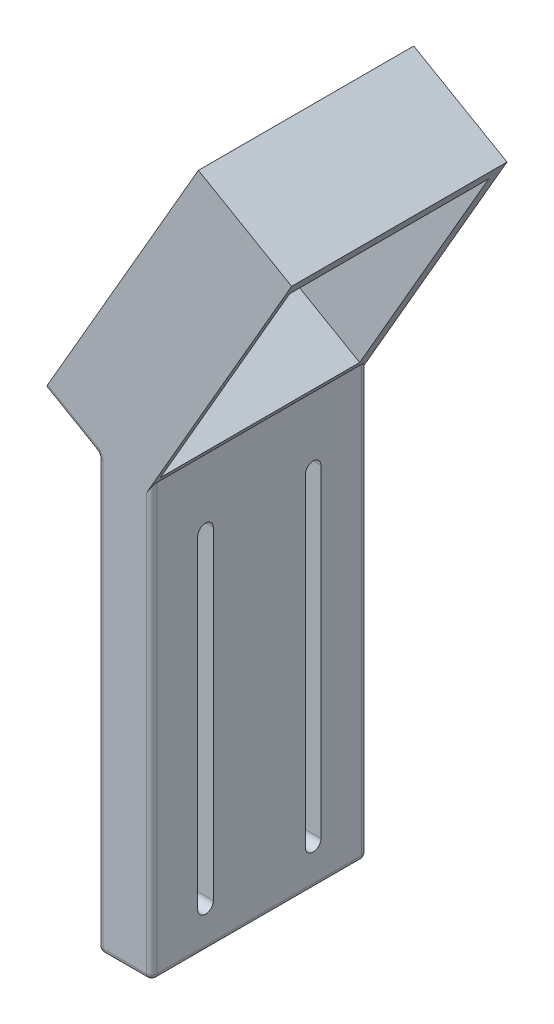
ISO-10303-21;
HEADER;
FILE_DESCRIPTION(('STEP AP214'),'2;1');
FILE_NAME('part.step','',(''),(''),'','','');
FILE_SCHEMA(('AUTOMOTIVE_DESIGN { 1 0 10303 214 1 1 1 1 }'));
ENDSEC;
DATA;
#1=APPLICATION_CONTEXT('core data for automotive mechanical design processes');
#2=APPLICATION_PROTOCOL_DEFINITION('international standard','automotive_design',2000,#1);
#3=PRODUCT_CONTEXT('',#1,'mechanical');
#4=PRODUCT('Part','Part','',(#3));
#5=PRODUCT_RELATED_PRODUCT_CATEGORY('part','',(#4));
#6=PRODUCT_DEFINITION_FORMATION('','',#4);
#7=PRODUCT_DEFINITION_CONTEXT('part definition',#1,'design');
#8=PRODUCT_DEFINITION('design','',#6,#7);
#9=PRODUCT_DEFINITION_SHAPE('','',#8);
#10=(LENGTH_UNIT() NAMED_UNIT(*) SI_UNIT(.MILLI.,.METRE.));
#11=(NAMED_UNIT(*) PLANE_ANGLE_UNIT() SI_UNIT($,.RADIAN.));
#12=(NAMED_UNIT(*) SI_UNIT($,.STERADIAN.) SOLID_ANGLE_UNIT());
#13=UNCERTAINTY_MEASURE_WITH_UNIT(LENGTH_MEASURE(1.E-05),#10,'distance_accuracy_value','');
#14=(GEOMETRIC_REPRESENTATION_CONTEXT(3) GLOBAL_UNCERTAINTY_ASSIGNED_CONTEXT((#13)) GLOBAL_UNIT_ASSIGNED_CONTEXT((#10,
#11,#12)) REPRESENTATION_CONTEXT('',''));
#15=CARTESIAN_POINT('',(0.,0.,0.));
#16=DIRECTION('',(0.,0.,1.));
#17=DIRECTION('',(1.,0.,0.));
#18=AXIS2_PLACEMENT_3D('',#15,#16,#17);
#19=CARTESIAN_POINT('',(0.,0.,40.));
#20=DIRECTION('',(1.,0.,0.));
#21=DIRECTION('',(0.,0.,-1.));
#22=AXIS2_PLACEMENT_3D('',#19,#20,#21);
#23=PLANE('',#22);
#24=DIRECTION('',(0.,1.,0.));
#25=VECTOR('',#24,1.);
#26=CARTESIAN_POINT('',(0.,7.5,11.45));
#27=LINE('',#26,#25);
#28=CARTESIAN_POINT('',(0.,7.5,11.45));
#29=VERTEX_POINT('',#28);
#30=CARTESIAN_POINT('',(0.,67.5,11.45));
#31=VERTEX_POINT('',#30);
#32=EDGE_CURVE('E275',#29,#31,#27,.T.);
#33=ORIENTED_EDGE('',*,*,#32,.F.);
#34=CARTESIAN_POINT('',(0.,7.5,10.));
#35=DIRECTION('',(-1.,0.,0.));
#36=DIRECTION('',(0.,0.,1.));
#37=AXIS2_PLACEMENT_3D('',#34,#35,#36);
#38=CIRCLE('',#37,1.45);
#39=CARTESIAN_POINT('',(0.,7.5,8.55));
#40=VERTEX_POINT('',#39);
#41=EDGE_CURVE('E273',#40,#29,#38,.T.);
#42=ORIENTED_EDGE('',*,*,#41,.F.);
#43=DIRECTION('',(0.,-1.,0.));
#44=VECTOR('',#43,1.);
#45=CARTESIAN_POINT('',(0.,7.5,8.55));
#46=LINE('',#45,#44);
#47=CARTESIAN_POINT('',(0.,67.5,8.55));
#48=VERTEX_POINT('',#47);
#49=EDGE_CURVE('E281',#48,#40,#46,.T.);
#50=ORIENTED_EDGE('',*,*,#49,.F.);
#51=CARTESIAN_POINT('',(0.,67.5,10.));
#52=DIRECTION('',(-1.,0.,0.));
#53=DIRECTION('',(0.,0.,1.));
#54=AXIS2_PLACEMENT_3D('',#51,#52,#53);
#55=CIRCLE('',#54,1.45);
#56=EDGE_CURVE('E278',#31,#48,#55,.T.);
#57=ORIENTED_EDGE('',*,*,#56,.F.);
#58=EDGE_LOOP('',(#33,#42,#50,#57));
#59=FACE_BOUND('',#58,.T.);
#60=DIRECTION('',(0.,1.,0.));
#61=VECTOR('',#60,1.);
#62=CARTESIAN_POINT('',(0.,7.5,31.45));
#63=LINE('',#62,#61);
#64=CARTESIAN_POINT('',(0.,7.5,31.45));
#65=VERTEX_POINT('',#64);
#66=CARTESIAN_POINT('',(0.,67.5,31.45));
#67=VERTEX_POINT('',#66);
#68=EDGE_CURVE('E314',#65,#67,#63,.T.);
#69=ORIENTED_EDGE('',*,*,#68,.F.);
#70=CARTESIAN_POINT('',(0.,7.5,30.));
#71=DIRECTION('',(-1.,0.,0.));
#72=DIRECTION('',(0.,0.,1.));
#73=AXIS2_PLACEMENT_3D('',#70,#71,#72);
#74=CIRCLE('',#73,1.45000000000001);
#75=CARTESIAN_POINT('',(0.,7.5,28.55));
#76=VERTEX_POINT('',#75);
#77=EDGE_CURVE('E317',#76,#65,#74,.T.);
#78=ORIENTED_EDGE('',*,*,#77,.F.);
#79=DIRECTION('',(0.,-1.,0.));
#80=VECTOR('',#79,1.);
#81=CARTESIAN_POINT('',(0.,7.5,28.55));
#82=LINE('',#81,#80);
#83=CARTESIAN_POINT('',(0.,67.5,28.55));
#84=VERTEX_POINT('',#83);
#85=EDGE_CURVE('E303',#84,#76,#82,.T.);
#86=ORIENTED_EDGE('',*,*,#85,.F.);
#87=CARTESIAN_POINT('',(0.,67.5,30.));
#88=DIRECTION('',(-1.,0.,0.));
#89=DIRECTION('',(0.,0.,1.));
#90=AXIS2_PLACEMENT_3D('',#87,#88,#89);
#91=CIRCLE('',#90,1.45000000000001);
#92=EDGE_CURVE('E311',#67,#84,#91,.T.);
#93=ORIENTED_EDGE('',*,*,#92,.F.);
#94=EDGE_LOOP('',(#69,#78,#86,#93));
#95=FACE_BOUND('',#94,.T.);
#96=DIRECTION('',(0.,-1.,0.));
#97=VECTOR('',#96,1.);
#98=CARTESIAN_POINT('',(0.,0.,39.));
#99=LINE('',#98,#97);
#100=CARTESIAN_POINT('',(0.,1.,39.));
#101=VERTEX_POINT('',#100);
#102=CARTESIAN_POINT('',(0.,79.4226497308103,39.));
#103=VERTEX_POINT('',#102);
#104=EDGE_CURVE('E390',#101,#103,#99,.F.);
#105=ORIENTED_EDGE('',*,*,#104,.T.);
#106=DIRECTION('',(0.,0.,-1.));
#107=VECTOR('',#106,1.);
#108=CARTESIAN_POINT('',(0.,79.4226497308103,0.));
#109=LINE('',#108,#107);
#110=CARTESIAN_POINT('',(0.,79.4226497308103,1.));
#111=VERTEX_POINT('',#110);
#112=EDGE_CURVE('E392',#103,#111,#109,.T.);
#113=ORIENTED_EDGE('',*,*,#112,.T.);
#114=DIRECTION('',(0.,-1.,0.));
#115=VECTOR('',#114,1.);
#116=CARTESIAN_POINT('',(0.,0.,1.));
#117=LINE('',#116,#115);
#118=CARTESIAN_POINT('',(0.,1.,1.));
#119=VERTEX_POINT('',#118);
#120=EDGE_CURVE('E386',#111,#119,#117,.T.);
#121=ORIENTED_EDGE('',*,*,#120,.T.);
#122=DIRECTION('',(0.,0.,-1.));
#123=VECTOR('',#122,1.);
#124=CARTESIAN_POINT('',(0.,1.,40.));
#125=LINE('',#124,#123);
#126=EDGE_CURVE('E388',#119,#101,#125,.F.);
#127=ORIENTED_EDGE('',*,*,#126,.T.);
#128=EDGE_LOOP('',(#105,#113,#121,#127));
#129=FACE_BOUND('',#128,.T.);
#130=ADVANCED_FACE('F41',(#59,#95,#129),#23,.F.);
#131=CARTESIAN_POINT('',(0.,0.,40.));
#132=DIRECTION('',(0.,1.,0.));
#133=DIRECTION('',(0.,0.,1.));
#134=AXIS2_PLACEMENT_3D('',#131,#132,#133);
#135=PLANE('',#134);
#136=DIRECTION('',(1.,0.,0.));
#137=VECTOR('',#136,1.);
#138=CARTESIAN_POINT('',(0.,0.,39.));
#139=LINE('',#138,#137);
#140=CARTESIAN_POINT('',(9.,0.,39.));
#141=VERTEX_POINT('',#140);
#142=CARTESIAN_POINT('',(1.,0.,39.));
#143=VERTEX_POINT('',#142);
#144=EDGE_CURVE('E399',#141,#143,#139,.F.);
#145=ORIENTED_EDGE('',*,*,#144,.T.);
#146=DIRECTION('',(0.,0.,-1.));
#147=VECTOR('',#146,1.);
#148=CARTESIAN_POINT('',(1.,0.,40.));
#149=LINE('',#148,#147);
#150=CARTESIAN_POINT('',(1.,0.,1.));
#151=VERTEX_POINT('',#150);
#152=EDGE_CURVE('E401',#143,#151,#149,.T.);
#153=ORIENTED_EDGE('',*,*,#152,.T.);
#154=DIRECTION('',(1.,0.,0.));
#155=VECTOR('',#154,1.);
#156=CARTESIAN_POINT('',(10.,0.,1.));
#157=LINE('',#156,#155);
#158=CARTESIAN_POINT('',(9.,0.,1.));
#159=VERTEX_POINT('',#158);
#160=EDGE_CURVE('E395',#151,#159,#157,.T.);
#161=ORIENTED_EDGE('',*,*,#160,.T.);
#162=DIRECTION('',(0.,0.,-1.));
#163=VECTOR('',#162,1.);
#164=CARTESIAN_POINT('',(9.,0.,40.));
#165=LINE('',#164,#163);
#166=EDGE_CURVE('E397',#159,#141,#165,.F.);
#167=ORIENTED_EDGE('',*,*,#166,.T.);
#168=EDGE_LOOP('',(#145,#153,#161,#167));
#169=FACE_BOUND('',#168,.T.);
#170=ADVANCED_FACE('F493',(#169),#135,.F.);
#171=CARTESIAN_POINT('',(9.99999999999999,80.,40.));
#172=DIRECTION('',(-1.,0.,0.));
#173=DIRECTION('',(0.,-1.,0.));
#174=AXIS2_PLACEMENT_3D('',#171,#172,#173);
#175=PLANE('',#174);
#176=DIRECTION('',(0.,1.,0.));
#177=VECTOR('',#176,1.);
#178=CARTESIAN_POINT('',(10.,7.5,8.55));
#179=LINE('',#178,#177);
#180=CARTESIAN_POINT('',(9.99999999999999,7.5,8.55));
#181=VERTEX_POINT('',#180);
#182=CARTESIAN_POINT('',(9.99999999999999,67.5,8.55));
#183=VERTEX_POINT('',#182);
#184=EDGE_CURVE('E266',#181,#183,#179,.T.);
#185=ORIENTED_EDGE('',*,*,#184,.F.);
#186=CARTESIAN_POINT('',(10.,7.5,10.));
#187=DIRECTION('',(-1.,0.,0.));
#188=DIRECTION('',(0.,-1.,0.));
#189=AXIS2_PLACEMENT_3D('',#186,#187,#188);
#190=CIRCLE('',#189,1.45);
#191=CARTESIAN_POINT('',(10.,7.5,11.45));
#192=VERTEX_POINT('',#191);
#193=EDGE_CURVE('E270',#192,#181,#190,.F.);
#194=ORIENTED_EDGE('',*,*,#193,.F.);
#195=DIRECTION('',(0.,-1.,0.));
#196=VECTOR('',#195,1.);
#197=CARTESIAN_POINT('',(10.,7.5,11.45));
#198=LINE('',#197,#196);
#199=CARTESIAN_POINT('',(9.99999999999999,67.5,11.45));
#200=VERTEX_POINT('',#199);
#201=EDGE_CURVE('E287',#200,#192,#198,.T.);
#202=ORIENTED_EDGE('',*,*,#201,.F.);
#203=CARTESIAN_POINT('',(9.99999999999999,67.5,10.));
#204=DIRECTION('',(-1.,0.,0.));
#205=DIRECTION('',(0.,-1.,0.));
#206=AXIS2_PLACEMENT_3D('',#203,#204,#205);
#207=CIRCLE('',#206,1.45);
#208=EDGE_CURVE('E264',#183,#200,#207,.F.);
#209=ORIENTED_EDGE('',*,*,#208,.F.);
#210=EDGE_LOOP('',(#185,#194,#202,#209));
#211=FACE_BOUND('',#210,.T.);
#212=DIRECTION('',(0.,1.,0.));
#213=VECTOR('',#212,1.);
#214=CARTESIAN_POINT('',(10.,7.5,28.55));
#215=LINE('',#214,#213);
#216=CARTESIAN_POINT('',(9.99999999999999,7.5,28.55));
#217=VERTEX_POINT('',#216);
#218=CARTESIAN_POINT('',(9.99999999999999,67.5,28.55));
#219=VERTEX_POINT('',#218);
#220=EDGE_CURVE('E322',#217,#219,#215,.T.);
#221=ORIENTED_EDGE('',*,*,#220,.F.);
#222=CARTESIAN_POINT('',(10.,7.5,30.));
#223=DIRECTION('',(-1.,0.,0.));
#224=DIRECTION('',(0.,-1.,0.));
#225=AXIS2_PLACEMENT_3D('',#222,#223,#224);
#226=CIRCLE('',#225,1.45000000000001);
#227=CARTESIAN_POINT('',(10.,7.5,31.45));
#228=VERTEX_POINT('',#227);
#229=EDGE_CURVE('E319',#228,#217,#226,.F.);
#230=ORIENTED_EDGE('',*,*,#229,.F.);
#231=DIRECTION('',(0.,-1.,0.));
#232=VECTOR('',#231,1.);
#233=CARTESIAN_POINT('',(10.,7.5,31.45));
#234=LINE('',#233,#232);
#235=CARTESIAN_POINT('',(9.99999999999999,67.5,31.45));
#236=VERTEX_POINT('',#235);
#237=EDGE_CURVE('E260',#236,#228,#234,.T.);
#238=ORIENTED_EDGE('',*,*,#237,.F.);
#239=CARTESIAN_POINT('',(9.99999999999999,67.5,30.));
#240=DIRECTION('',(-1.,0.,0.));
#241=DIRECTION('',(0.,-1.,0.));
#242=AXIS2_PLACEMENT_3D('',#239,#240,#241);
#243=CIRCLE('',#242,1.45000000000001);
#244=EDGE_CURVE('E267',#219,#236,#243,.F.);
#245=ORIENTED_EDGE('',*,*,#244,.F.);
#246=EDGE_LOOP('',(#221,#230,#238,#245));
#247=FACE_BOUND('',#246,.T.);
#248=DIRECTION('',(0.,0.,-1.));
#249=VECTOR('',#248,1.);
#250=CARTESIAN_POINT('',(10.,1.,40.));
#251=LINE('',#250,#249);
#252=CARTESIAN_POINT('',(10.,1.,39.));
#253=VERTEX_POINT('',#252);
#254=CARTESIAN_POINT('',(10.,1.,1.));
#255=VERTEX_POINT('',#254);
#256=EDGE_CURVE('E406',#253,#255,#251,.T.);
#257=ORIENTED_EDGE('',*,*,#256,.T.);
#258=DIRECTION('',(0.,1.,0.));
#259=VECTOR('',#258,1.);
#260=CARTESIAN_POINT('',(9.99999999999999,80.,1.));
#261=LINE('',#260,#259);
#262=CARTESIAN_POINT('',(9.99999999999999,80.,1.));
#263=VERTEX_POINT('',#262);
#264=EDGE_CURVE('E408',#255,#263,#261,.T.);
#265=ORIENTED_EDGE('',*,*,#264,.T.);
#266=DIRECTION('',(0.,0.,-1.));
#267=VECTOR('',#266,1.);
#268=CARTESIAN_POINT('',(9.99999999999999,80.,40.));
#269=LINE('',#268,#267);
#270=CARTESIAN_POINT('',(9.99999999999999,80.,39.));
#271=VERTEX_POINT('',#270);
#272=EDGE_CURVE('E349',#271,#263,#269,.T.);
#273=ORIENTED_EDGE('',*,*,#272,.F.);
#274=DIRECTION('',(0.,1.,0.));
#275=VECTOR('',#274,1.);
#276=CARTESIAN_POINT('',(9.99999999999999,80.,39.));
#277=LINE('',#276,#275);
#278=EDGE_CURVE('E404',#271,#253,#277,.F.);
#279=ORIENTED_EDGE('',*,*,#278,.T.);
#280=EDGE_LOOP('',(#257,#265,#273,#279));
#281=FACE_BOUND('',#280,.T.);
#282=ADVANCED_FACE('F473',(#211,#247,#281),#175,.F.);
#283=CARTESIAN_POINT('',(9.99999999999999,80.,40.));
#284=DIRECTION('',(-0.866025403784442,0.499999999999995,0.));
#285=DIRECTION('',(-0.499999999999995,-0.866025403784442,0.));
#286=AXIS2_PLACEMENT_3D('',#283,#284,#285);
#287=PLANE('',#286);
#288=DIRECTION('',(0.,0.,-1.));
#289=VECTOR('',#288,1.);
#290=CARTESIAN_POINT('',(34.6367863288574,122.6721656568,2.));
#291=LINE('',#290,#289);
#292=CARTESIAN_POINT('',(34.6367863288574,122.6721656568,39.));
#293=VERTEX_POINT('',#292);
#294=CARTESIAN_POINT('',(34.6367863288574,122.6721656568,2.));
#295=VERTEX_POINT('',#294);
#296=EDGE_CURVE('E235',#293,#295,#291,.T.);
#297=ORIENTED_EDGE('',*,*,#296,.T.);
#298=DIRECTION('',(-0.499999999999995,-0.866025403784442,0.));
#299=VECTOR('',#298,1.);
#300=CARTESIAN_POINT('',(10.6367863288577,81.1029462751467,2.));
#301=LINE('',#300,#299);
#302=CARTESIAN_POINT('',(10.6367863288577,81.1029462751467,2.));
#303=VERTEX_POINT('',#302);
#304=EDGE_CURVE('E229',#295,#303,#301,.T.);
#305=ORIENTED_EDGE('',*,*,#304,.T.);
#306=DIRECTION('',(0.,0.,1.));
#307=VECTOR('',#306,1.);
#308=CARTESIAN_POINT('',(10.6367863288577,81.1029462751467,2.));
#309=LINE('',#308,#307);
#310=CARTESIAN_POINT('',(10.6367863288577,81.1029462751468,39.));
#311=VERTEX_POINT('',#310);
#312=EDGE_CURVE('E238',#303,#311,#309,.T.);
#313=ORIENTED_EDGE('',*,*,#312,.T.);
#314=DIRECTION('',(0.499999999999995,0.866025403784442,0.));
#315=VECTOR('',#314,1.);
#316=CARTESIAN_POINT('',(10.6367863288577,81.1029462751467,39.));
#317=LINE('',#316,#315);
#318=EDGE_CURVE('E58',#311,#293,#317,.T.);
#319=ORIENTED_EDGE('',*,*,#318,.T.);
#320=EDGE_LOOP('',(#297,#305,#313,#319));
#321=FACE_BOUND('',#320,.T.);
#322=DIRECTION('',(0.499999999999995,0.866025403784442,0.));
#323=VECTOR('',#322,1.);
#324=CARTESIAN_POINT('',(9.99999999999999,80.,0.));
#325=LINE('',#324,#323);
#326=CARTESIAN_POINT('',(8.99999999999999,78.2679491924311,0.));
#327=VERTEX_POINT('',#326);
#328=CARTESIAN_POINT('',(35.9999999999997,125.033320996791,0.));
#329=VERTEX_POINT('',#328);
#330=EDGE_CURVE('E335',#327,#329,#325,.T.);
#331=ORIENTED_EDGE('',*,*,#330,.T.);
#332=DIRECTION('',(0.,0.,-1.));
#333=VECTOR('',#332,1.);
#334=CARTESIAN_POINT('',(35.9999999999997,125.033320996791,40.));
#335=LINE('',#334,#333);
#336=CARTESIAN_POINT('',(35.9999999999997,125.033320996791,40.));
#337=VERTEX_POINT('',#336);
#338=EDGE_CURVE('E346',#337,#329,#335,.T.);
#339=ORIENTED_EDGE('',*,*,#338,.F.);
#340=DIRECTION('',(0.499999999999995,0.866025403784442,0.));
#341=VECTOR('',#340,1.);
#342=CARTESIAN_POINT('',(9.99999999999999,80.,40.));
#343=LINE('',#342,#341);
#344=CARTESIAN_POINT('',(8.99999999999999,78.2679491924311,40.));
#345=VERTEX_POINT('',#344);
#346=EDGE_CURVE('E326',#345,#337,#343,.T.);
#347=ORIENTED_EDGE('',*,*,#346,.F.);
#348=CARTESIAN_POINT('',(8.99999999999999,78.2679491924311,39.));
#349=DIRECTION('',(-0.866025403784442,0.499999999999995,0.));
#350=DIRECTION('',(0.499999999999995,0.866025403784442,0.));
#351=AXIS2_PLACEMENT_3D('',#348,#349,#350);
#352=ELLIPSE('',#351,2.00000000000002,1.);
#353=EDGE_CURVE('E11',#345,#271,#352,.T.);
#354=ORIENTED_EDGE('',*,*,#353,.T.);
#355=ORIENTED_EDGE('',*,*,#272,.T.);
#356=CARTESIAN_POINT('',(8.99999999999999,78.2679491924311,1.));
#357=DIRECTION('',(-0.866025403784442,0.499999999999995,0.));
#358=DIRECTION('',(-0.499999999999995,-0.866025403784442,0.));
#359=AXIS2_PLACEMENT_3D('',#356,#357,#358);
#360=ELLIPSE('',#359,2.00000000000002,1.);
#361=EDGE_CURVE('E50',#263,#327,#360,.T.);
#362=ORIENTED_EDGE('',*,*,#361,.T.);
#363=EDGE_LOOP('',(#331,#339,#347,#354,#355,#362));
#364=FACE_BOUND('',#363,.T.);
#365=ADVANCED_FACE('F242',(#321,#364),#287,.F.);
#366=CARTESIAN_POINT('',(35.9999999999997,125.033320996791,40.));
#367=DIRECTION('',(-0.499999999999995,-0.866025403784442,0.));
#368=DIRECTION('',(0.866025403784442,-0.499999999999995,0.));
#369=AXIS2_PLACEMENT_3D('',#366,#367,#368);
#370=PLANE('',#369);
#371=DIRECTION('',(-0.866025403784442,0.499999999999995,0.));
#372=VECTOR('',#371,1.);
#373=CARTESIAN_POINT('',(35.9999999999997,125.033320996791,0.));
#374=LINE('',#373,#372);
#375=CARTESIAN_POINT('',(18.6794919243109,135.033320996791,0.));
#376=VERTEX_POINT('',#375);
#377=EDGE_CURVE('E337',#329,#376,#374,.T.);
#378=ORIENTED_EDGE('',*,*,#377,.T.);
#379=DIRECTION('',(0.,0.,-1.));
#380=VECTOR('',#379,1.);
#381=CARTESIAN_POINT('',(18.6794919243109,135.033320996791,40.));
#382=LINE('',#381,#380);
#383=CARTESIAN_POINT('',(18.6794919243109,135.033320996791,40.));
#384=VERTEX_POINT('',#383);
#385=EDGE_CURVE('E343',#384,#376,#382,.T.);
#386=ORIENTED_EDGE('',*,*,#385,.F.);
#387=DIRECTION('',(-0.866025403784442,0.499999999999995,0.));
#388=VECTOR('',#387,1.);
#389=CARTESIAN_POINT('',(35.9999999999997,125.033320996791,40.));
#390=LINE('',#389,#388);
#391=EDGE_CURVE('E328',#337,#384,#390,.T.);
#392=ORIENTED_EDGE('',*,*,#391,.F.);
#393=ORIENTED_EDGE('',*,*,#338,.T.);
#394=EDGE_LOOP('',(#378,#386,#392,#393));
#395=FACE_BOUND('',#394,.T.);
#396=ADVANCED_FACE('F515',(#395),#370,.F.);
#397=CARTESIAN_POINT('',(18.6794919243109,135.033320996791,40.));
#398=DIRECTION('',(0.866025403784442,-0.499999999999994,0.));
#399=DIRECTION('',(0.499999999999994,0.866025403784442,0.));
#400=AXIS2_PLACEMENT_3D('',#397,#398,#399);
#401=PLANE('',#400);
#402=DIRECTION('',(0.,0.,1.));
#403=VECTOR('',#402,1.);
#404=CARTESIAN_POINT('',(-6.68372174683116,91.1029462751466,2.));
#405=LINE('',#404,#403);
#406=CARTESIAN_POINT('',(-6.68372174683116,91.1029462751466,2.));
#407=VERTEX_POINT('',#406);
#408=CARTESIAN_POINT('',(-6.68372174683116,91.1029462751466,39.));
#409=VERTEX_POINT('',#408);
#410=EDGE_CURVE('E254',#407,#409,#405,.T.);
#411=ORIENTED_EDGE('',*,*,#410,.F.);
#412=DIRECTION('',(-0.499999999999995,-0.866025403784442,0.));
#413=VECTOR('',#412,1.);
#414=CARTESIAN_POINT('',(-6.68372174683116,91.1029462751466,2.));
#415=LINE('',#414,#413);
#416=CARTESIAN_POINT('',(17.3162782531686,132.6721656568,2.));
#417=VERTEX_POINT('',#416);
#418=EDGE_CURVE('E66',#417,#407,#415,.T.);
#419=ORIENTED_EDGE('',*,*,#418,.F.);
#420=DIRECTION('',(0.,0.,-1.));
#421=VECTOR('',#420,1.);
#422=CARTESIAN_POINT('',(17.3162782531686,132.6721656568,2.));
#423=LINE('',#422,#421);
#424=CARTESIAN_POINT('',(17.3162782531686,132.6721656568,39.));
#425=VERTEX_POINT('',#424);
#426=EDGE_CURVE('E245',#425,#417,#423,.T.);
#427=ORIENTED_EDGE('',*,*,#426,.F.);
#428=DIRECTION('',(0.499999999999995,0.866025403784442,0.));
#429=VECTOR('',#428,1.);
#430=CARTESIAN_POINT('',(-6.68372174683116,91.1029462751466,39.));
#431=LINE('',#430,#429);
#432=EDGE_CURVE('E248',#409,#425,#431,.T.);
#433=ORIENTED_EDGE('',*,*,#432,.F.);
#434=EDGE_LOOP('',(#411,#419,#427,#433));
#435=FACE_BOUND('',#434,.T.);
#436=DIRECTION('',(0.,0.,-1.));
#437=VECTOR('',#436,1.);
#438=CARTESIAN_POINT('',(-9.82050807568877,85.6698729810777,40.));
#439=LINE('',#438,#437);
#440=CARTESIAN_POINT('',(-9.82050807568877,85.6698729810777,39.));
#441=VERTEX_POINT('',#440);
#442=CARTESIAN_POINT('',(-9.82050807568877,85.6698729810777,1.));
#443=VERTEX_POINT('',#442);
#444=EDGE_CURVE('E334',#441,#443,#439,.T.);
#445=ORIENTED_EDGE('',*,*,#444,.F.);
#446=CARTESIAN_POINT('',(-9.32050807568878,86.5358983848621,39.));
#447=DIRECTION('',(0.866025403784442,-0.499999999999994,0.));
#448=DIRECTION('',(0.499999999999994,0.866025403784442,0.));
#449=AXIS2_PLACEMENT_3D('',#446,#447,#448);
#450=CIRCLE('',#449,1.);
#451=CARTESIAN_POINT('',(-9.32050807568877,86.5358983848621,40.));
#452=VERTEX_POINT('',#451);
#453=EDGE_CURVE('E373',#441,#452,#450,.F.);
#454=ORIENTED_EDGE('',*,*,#453,.T.);
#455=DIRECTION('',(-0.499999999999994,-0.866025403784442,0.));
#456=VECTOR('',#455,1.);
#457=CARTESIAN_POINT('',(18.6794919243109,135.033320996791,40.));
#458=LINE('',#457,#456);
#459=EDGE_CURVE('E331',#384,#452,#458,.T.);
#460=ORIENTED_EDGE('',*,*,#459,.F.);
#461=ORIENTED_EDGE('',*,*,#385,.T.);
#462=DIRECTION('',(-0.499999999999994,-0.866025403784442,0.));
#463=VECTOR('',#462,1.);
#464=CARTESIAN_POINT('',(18.6794919243109,135.033320996791,0.));
#465=LINE('',#464,#463);
#466=CARTESIAN_POINT('',(-9.32050807568877,86.5358983848622,0.));
#467=VERTEX_POINT('',#466);
#468=EDGE_CURVE('E329',#376,#467,#465,.T.);
#469=ORIENTED_EDGE('',*,*,#468,.T.);
#470=CARTESIAN_POINT('',(-9.32050807568877,86.5358983848622,1.));
#471=DIRECTION('',(0.866025403784442,-0.499999999999994,0.));
#472=DIRECTION('',(0.499999999999994,0.866025403784442,0.));
#473=AXIS2_PLACEMENT_3D('',#470,#471,#472);
#474=CIRCLE('',#473,1.);
#475=EDGE_CURVE('E371',#467,#443,#474,.F.);
#476=ORIENTED_EDGE('',*,*,#475,.T.);
#477=EDGE_LOOP('',(#445,#454,#460,#461,#469,#476));
#478=FACE_BOUND('',#477,.T.);
#479=ADVANCED_FACE('F736',(#435,#478),#401,.F.);
#480=CARTESIAN_POINT('',(-9.82050807568877,85.6698729810777,40.));
#481=DIRECTION('',(0.499999999999995,0.866025403784442,0.));
#482=DIRECTION('',(-0.866025403784442,0.499999999999995,0.));
#483=AXIS2_PLACEMENT_3D('',#480,#481,#482);
#484=PLANE('',#483);
#485=DIRECTION('',(0.,0.,-1.));
#486=VECTOR('',#485,1.);
#487=CARTESIAN_POINT('',(-0.500000000000002,80.2886751345948,40.));
#488=LINE('',#487,#486);
#489=CARTESIAN_POINT('',(-0.500000000000003,80.2886751345948,1.));
#490=VERTEX_POINT('',#489);
#491=CARTESIAN_POINT('',(-0.500000000000003,80.2886751345948,39.));
#492=VERTEX_POINT('',#491);
#493=EDGE_CURVE('E365',#490,#492,#488,.F.);
#494=ORIENTED_EDGE('',*,*,#493,.T.);
#495=DIRECTION('',(0.866025403784442,-0.499999999999995,0.));
#496=VECTOR('',#495,1.);
#497=CARTESIAN_POINT('',(-9.82050807568877,85.6698729810777,39.));
#498=LINE('',#497,#496);
#499=EDGE_CURVE('E369',#492,#441,#498,.F.);
#500=ORIENTED_EDGE('',*,*,#499,.T.);
#501=ORIENTED_EDGE('',*,*,#444,.T.);
#502=DIRECTION('',(0.866025403784442,-0.499999999999995,0.));
#503=VECTOR('',#502,1.);
#504=CARTESIAN_POINT('',(0.,80.,1.));
#505=LINE('',#504,#503);
#506=EDGE_CURVE('E367',#443,#490,#505,.T.);
#507=ORIENTED_EDGE('',*,*,#506,.T.);
#508=EDGE_LOOP('',(#494,#500,#501,#507));
#509=FACE_BOUND('',#508,.T.);
#510=ADVANCED_FACE('F731',(#509),#484,.F.);
#511=CARTESIAN_POINT('',(0.,0.,40.));
#512=DIRECTION('',(0.,0.,-1.));
#513=DIRECTION('',(-1.,0.,0.));
#514=AXIS2_PLACEMENT_3D('',#511,#512,#513);
#515=PLANE('',#514);
#516=ORIENTED_EDGE('',*,*,#459,.T.);
#517=DIRECTION('',(0.866025403784442,-0.499999999999995,0.));
#518=VECTOR('',#517,1.);
#519=CARTESIAN_POINT('',(35.1410161513773,60.8660254037848,40.));
#520=LINE('',#519,#518);
#521=CARTESIAN_POINT('',(0.,81.1547005383792,40.));
#522=VERTEX_POINT('',#521);
#523=EDGE_CURVE('E362',#452,#522,#520,.T.);
#524=ORIENTED_EDGE('',*,*,#523,.T.);
#525=CARTESIAN_POINT('',(-1.,79.4226497308103,40.));
#526=DIRECTION('',(0.,0.,-1.));
#527=DIRECTION('',(-1.,0.,0.));
#528=AXIS2_PLACEMENT_3D('',#525,#526,#527);
#529=CIRCLE('',#528,2.);
#530=CARTESIAN_POINT('',(1.,79.4226497308103,40.));
#531=VERTEX_POINT('',#530);
#532=EDGE_CURVE('E359',#531,#522,#529,.F.);
#533=ORIENTED_EDGE('',*,*,#532,.F.);
#534=DIRECTION('',(0.,-1.,0.));
#535=VECTOR('',#534,1.);
#536=CARTESIAN_POINT('',(1.,0.,40.));
#537=LINE('',#536,#535);
#538=CARTESIAN_POINT('',(1.,1.,40.));
#539=VERTEX_POINT('',#538);
#540=EDGE_CURVE('E357',#531,#539,#537,.T.);
#541=ORIENTED_EDGE('',*,*,#540,.T.);
#542=DIRECTION('',(1.,0.,0.));
#543=VECTOR('',#542,1.);
#544=CARTESIAN_POINT('',(0.,1.,40.));
#545=LINE('',#544,#543);
#546=CARTESIAN_POINT('',(9.,1.,40.));
#547=VERTEX_POINT('',#546);
#548=EDGE_CURVE('E355',#539,#547,#545,.T.);
#549=ORIENTED_EDGE('',*,*,#548,.T.);
#550=DIRECTION('',(0.,1.,0.));
#551=VECTOR('',#550,1.);
#552=CARTESIAN_POINT('',(9.,0.,40.));
#553=LINE('',#552,#551);
#554=EDGE_CURVE('E352',#547,#345,#553,.T.);
#555=ORIENTED_EDGE('',*,*,#554,.T.);
#556=ORIENTED_EDGE('',*,*,#346,.T.);
#557=ORIENTED_EDGE('',*,*,#391,.T.);
#558=EDGE_LOOP('',(#516,#524,#533,#541,#549,#555,#556,#557));
#559=FACE_BOUND('',#558,.T.);
#560=ADVANCED_FACE('F519',(#559),#515,.F.);
#561=CARTESIAN_POINT('',(0.,0.,0.));
#562=DIRECTION('',(0.,0.,-1.));
#563=DIRECTION('',(-1.,0.,0.));
#564=AXIS2_PLACEMENT_3D('',#561,#562,#563);
#565=PLANE('',#564);
#566=CARTESIAN_POINT('',(-1.,79.4226497308103,0.));
#567=DIRECTION('',(0.,0.,-1.));
#568=DIRECTION('',(-1.,0.,0.));
#569=AXIS2_PLACEMENT_3D('',#566,#567,#568);
#570=CIRCLE('',#569,2.);
#571=CARTESIAN_POINT('',(0.,81.1547005383792,0.));
#572=VERTEX_POINT('',#571);
#573=CARTESIAN_POINT('',(1.,79.4226497308103,0.));
#574=VERTEX_POINT('',#573);
#575=EDGE_CURVE('E381',#572,#574,#570,.T.);
#576=ORIENTED_EDGE('',*,*,#575,.F.);
#577=DIRECTION('',(0.866025403784442,-0.499999999999995,0.));
#578=VECTOR('',#577,1.);
#579=CARTESIAN_POINT('',(-9.32050807568877,86.5358983848622,0.));
#580=LINE('',#579,#578);
#581=EDGE_CURVE('E384',#572,#467,#580,.F.);
#582=ORIENTED_EDGE('',*,*,#581,.T.);
#583=ORIENTED_EDGE('',*,*,#468,.F.);
#584=ORIENTED_EDGE('',*,*,#377,.F.);
#585=ORIENTED_EDGE('',*,*,#330,.F.);
#586=DIRECTION('',(0.,1.,0.));
#587=VECTOR('',#586,1.);
#588=CARTESIAN_POINT('',(9.,0.,0.));
#589=LINE('',#588,#587);
#590=CARTESIAN_POINT('',(9.,1.,0.));
#591=VERTEX_POINT('',#590);
#592=EDGE_CURVE('E375',#327,#591,#589,.F.);
#593=ORIENTED_EDGE('',*,*,#592,.T.);
#594=DIRECTION('',(1.,0.,0.));
#595=VECTOR('',#594,1.);
#596=CARTESIAN_POINT('',(0.,1.,0.));
#597=LINE('',#596,#595);
#598=CARTESIAN_POINT('',(1.,1.,0.));
#599=VERTEX_POINT('',#598);
#600=EDGE_CURVE('E377',#591,#599,#597,.F.);
#601=ORIENTED_EDGE('',*,*,#600,.T.);
#602=DIRECTION('',(0.,-1.,0.));
#603=VECTOR('',#602,1.);
#604=CARTESIAN_POINT('',(1.,80.,0.));
#605=LINE('',#604,#603);
#606=EDGE_CURVE('E379',#599,#574,#605,.F.);
#607=ORIENTED_EDGE('',*,*,#606,.T.);
#608=EDGE_LOOP('',(#576,#582,#583,#584,#585,#593,#601,#607));
#609=FACE_BOUND('',#608,.T.);
#610=ADVANCED_FACE('F509',(#609),#565,.T.);
#611=CARTESIAN_POINT('',(8.99999999999999,80.,1.));
#612=DIRECTION('',(0.,-1.,0.));
#613=DIRECTION('',(1.,0.,0.));
#614=AXIS2_PLACEMENT_3D('',#611,#612,#613);
#615=CYLINDRICAL_SURFACE('',#614,1.);
#616=CARTESIAN_POINT('',(9.,1.,1.));
#617=DIRECTION('',(0.,-1.,0.));
#618=DIRECTION('',(1.,0.,0.));
#619=AXIS2_PLACEMENT_3D('',#616,#617,#618);
#620=CIRCLE('',#619,1.);
#621=EDGE_CURVE('E45',#591,#255,#620,.T.);
#622=ORIENTED_EDGE('',*,*,#621,.F.);
#623=ORIENTED_EDGE('',*,*,#592,.F.);
#624=ORIENTED_EDGE('',*,*,#361,.F.);
#625=ORIENTED_EDGE('',*,*,#264,.F.);
#626=EDGE_LOOP('',(#622,#623,#624,#625));
#627=FACE_BOUND('',#626,.T.);
#628=ADVANCED_FACE('F43',(#627),#615,.T.);
#629=CARTESIAN_POINT('',(9.,1.,1.));
#630=DIRECTION('',(1.,0.,0.));
#631=DIRECTION('',(0.,1.,0.));
#632=AXIS2_PLACEMENT_3D('',#629,#630,#631);
#633=SPHERICAL_SURFACE('',#632,1.);
#634=CARTESIAN_POINT('',(9.,1.,1.));
#635=DIRECTION('',(1.,0.,0.));
#636=DIRECTION('',(0.,0.,-1.));
#637=AXIS2_PLACEMENT_3D('',#634,#635,#636);
#638=CIRCLE('',#637,1.);
#639=EDGE_CURVE('E453',#591,#159,#638,.F.);
#640=ORIENTED_EDGE('',*,*,#639,.F.);
#641=ORIENTED_EDGE('',*,*,#621,.T.);
#642=CARTESIAN_POINT('',(9.,1.,1.));
#643=DIRECTION('',(0.,0.,-1.));
#644=DIRECTION('',(-1.,0.,0.));
#645=AXIS2_PLACEMENT_3D('',#642,#643,#644);
#646=CIRCLE('',#645,1.);
#647=EDGE_CURVE('E455',#159,#255,#646,.F.);
#648=ORIENTED_EDGE('',*,*,#647,.F.);
#649=EDGE_LOOP('',(#640,#641,#648));
#650=FACE_BOUND('',#649,.T.);
#651=ADVANCED_FACE('F465',(#650),#633,.T.);
#652=CARTESIAN_POINT('',(9.,0.,39.));
#653=DIRECTION('',(0.,1.,0.));
#654=DIRECTION('',(-1.,0.,0.));
#655=AXIS2_PLACEMENT_3D('',#652,#653,#654);
#656=CYLINDRICAL_SURFACE('',#655,1.);
#657=ORIENTED_EDGE('',*,*,#353,.F.);
#658=ORIENTED_EDGE('',*,*,#554,.F.);
#659=CARTESIAN_POINT('',(9.,1.,39.));
#660=DIRECTION('',(0.,-1.,0.));
#661=DIRECTION('',(0.,0.,-1.));
#662=AXIS2_PLACEMENT_3D('',#659,#660,#661);
#663=CIRCLE('',#662,1.);
#664=EDGE_CURVE('E450',#253,#547,#663,.T.);
#665=ORIENTED_EDGE('',*,*,#664,.F.);
#666=ORIENTED_EDGE('',*,*,#278,.F.);
#667=EDGE_LOOP('',(#657,#658,#665,#666));
#668=FACE_BOUND('',#667,.T.);
#669=ADVANCED_FACE('F479',(#668),#656,.T.);
#670=CARTESIAN_POINT('',(9.,1.,40.));
#671=DIRECTION('',(0.,0.,-1.));
#672=DIRECTION('',(-1.,0.,0.));
#673=AXIS2_PLACEMENT_3D('',#670,#671,#672);
#674=CYLINDRICAL_SURFACE('',#673,1.);
#675=ORIENTED_EDGE('',*,*,#647,.T.);
#676=ORIENTED_EDGE('',*,*,#256,.F.);
#677=CARTESIAN_POINT('',(9.,1.,39.));
#678=DIRECTION('',(0.,0.,1.));
#679=DIRECTION('',(1.,0.,0.));
#680=AXIS2_PLACEMENT_3D('',#677,#678,#679);
#681=CIRCLE('',#680,1.);
#682=EDGE_CURVE('E447',#141,#253,#681,.T.);
#683=ORIENTED_EDGE('',*,*,#682,.F.);
#684=ORIENTED_EDGE('',*,*,#166,.F.);
#685=EDGE_LOOP('',(#675,#676,#683,#684));
#686=FACE_BOUND('',#685,.T.);
#687=ADVANCED_FACE('F482',(#686),#674,.T.);
#688=CARTESIAN_POINT('',(0.,1.,1.));
#689=DIRECTION('',(-1.,0.,0.));
#690=DIRECTION('',(0.,0.,1.));
#691=AXIS2_PLACEMENT_3D('',#688,#689,#690);
#692=CYLINDRICAL_SURFACE('',#691,1.);
#693=ORIENTED_EDGE('',*,*,#639,.T.);
#694=ORIENTED_EDGE('',*,*,#160,.F.);
#695=CARTESIAN_POINT('',(1.,1.,1.));
#696=DIRECTION('',(-1.,0.,0.));
#697=DIRECTION('',(0.,0.,1.));
#698=AXIS2_PLACEMENT_3D('',#695,#696,#697);
#699=CIRCLE('',#698,1.);
#700=EDGE_CURVE('E444',#599,#151,#699,.T.);
#701=ORIENTED_EDGE('',*,*,#700,.F.);
#702=ORIENTED_EDGE('',*,*,#600,.F.);
#703=EDGE_LOOP('',(#693,#694,#701,#702));
#704=FACE_BOUND('',#703,.T.);
#705=ADVANCED_FACE('F507',(#704),#692,.T.);
#706=CARTESIAN_POINT('',(9.,1.,39.));
#707=DIRECTION('',(1.,0.,0.));
#708=DIRECTION('',(0.,1.,0.));
#709=AXIS2_PLACEMENT_3D('',#706,#707,#708);
#710=SPHERICAL_SURFACE('',#709,1.);
#711=ORIENTED_EDGE('',*,*,#682,.T.);
#712=ORIENTED_EDGE('',*,*,#664,.T.);
#713=CARTESIAN_POINT('',(9.,1.,39.));
#714=DIRECTION('',(1.,0.,0.));
#715=DIRECTION('',(0.,0.,-1.));
#716=AXIS2_PLACEMENT_3D('',#713,#714,#715);
#717=CIRCLE('',#716,1.);
#718=EDGE_CURVE('E441',#141,#547,#717,.F.);
#719=ORIENTED_EDGE('',*,*,#718,.F.);
#720=EDGE_LOOP('',(#711,#712,#719));
#721=FACE_BOUND('',#720,.T.);
#722=ADVANCED_FACE('F486',(#721),#710,.T.);
#723=CARTESIAN_POINT('',(1.,1.,1.));
#724=DIRECTION('',(0.,-1.,0.));
#725=DIRECTION('',(0.,0.,-1.));
#726=AXIS2_PLACEMENT_3D('',#723,#724,#725);
#727=SPHERICAL_SURFACE('',#726,1.);
#728=CARTESIAN_POINT('',(1.,1.,1.));
#729=DIRECTION('',(0.,-1.,0.));
#730=DIRECTION('',(0.,0.,-1.));
#731=AXIS2_PLACEMENT_3D('',#728,#729,#730);
#732=CIRCLE('',#731,1.);
#733=EDGE_CURVE('E436',#599,#119,#732,.F.);
#734=ORIENTED_EDGE('',*,*,#733,.F.);
#735=ORIENTED_EDGE('',*,*,#700,.T.);
#736=CARTESIAN_POINT('',(1.,1.,1.));
#737=DIRECTION('',(0.,0.,-1.));
#738=DIRECTION('',(-1.,0.,0.));
#739=AXIS2_PLACEMENT_3D('',#736,#737,#738);
#740=CIRCLE('',#739,1.);
#741=EDGE_CURVE('E439',#119,#151,#740,.F.);
#742=ORIENTED_EDGE('',*,*,#741,.F.);
#743=EDGE_LOOP('',(#734,#735,#742));
#744=FACE_BOUND('',#743,.T.);
#745=ADVANCED_FACE('F504',(#744),#727,.T.);
#746=CARTESIAN_POINT('',(0.,1.,39.));
#747=DIRECTION('',(1.,0.,0.));
#748=DIRECTION('',(0.,0.,-1.));
#749=AXIS2_PLACEMENT_3D('',#746,#747,#748);
#750=CYLINDRICAL_SURFACE('',#749,1.);
#751=ORIENTED_EDGE('',*,*,#718,.T.);
#752=ORIENTED_EDGE('',*,*,#548,.F.);
#753=CARTESIAN_POINT('',(1.,1.,39.));
#754=DIRECTION('',(-1.,0.,0.));
#755=DIRECTION('',(0.,0.,1.));
#756=AXIS2_PLACEMENT_3D('',#753,#754,#755);
#757=CIRCLE('',#756,1.);
#758=EDGE_CURVE('E433',#143,#539,#757,.T.);
#759=ORIENTED_EDGE('',*,*,#758,.F.);
#760=ORIENTED_EDGE('',*,*,#144,.F.);
#761=EDGE_LOOP('',(#751,#752,#759,#760));
#762=FACE_BOUND('',#761,.T.);
#763=ADVANCED_FACE('F490',(#762),#750,.T.);
#764=CARTESIAN_POINT('',(1.,1.,40.));
#765=DIRECTION('',(0.,0.,-1.));
#766=DIRECTION('',(-1.,0.,0.));
#767=AXIS2_PLACEMENT_3D('',#764,#765,#766);
#768=CYLINDRICAL_SURFACE('',#767,1.);
#769=ORIENTED_EDGE('',*,*,#741,.T.);
#770=ORIENTED_EDGE('',*,*,#152,.F.);
#771=CARTESIAN_POINT('',(1.,1.,39.));
#772=DIRECTION('',(0.,0.,1.));
#773=DIRECTION('',(1.,0.,0.));
#774=AXIS2_PLACEMENT_3D('',#771,#772,#773);
#775=CIRCLE('',#774,1.);
#776=EDGE_CURVE('E430',#101,#143,#775,.T.);
#777=ORIENTED_EDGE('',*,*,#776,.F.);
#778=ORIENTED_EDGE('',*,*,#126,.F.);
#779=EDGE_LOOP('',(#769,#770,#777,#778));
#780=FACE_BOUND('',#779,.T.);
#781=ADVANCED_FACE('F496',(#780),#768,.T.);
#782=CARTESIAN_POINT('',(1.,0.,1.));
#783=DIRECTION('',(0.,1.,0.));
#784=DIRECTION('',(0.,0.,1.));
#785=AXIS2_PLACEMENT_3D('',#782,#783,#784);
#786=CYLINDRICAL_SURFACE('',#785,1.);
#787=ORIENTED_EDGE('',*,*,#733,.T.);
#788=ORIENTED_EDGE('',*,*,#120,.F.);
#789=CARTESIAN_POINT('',(1.,79.4226497308103,1.));
#790=DIRECTION('',(0.,1.,0.));
#791=DIRECTION('',(0.,0.,1.));
#792=AXIS2_PLACEMENT_3D('',#789,#790,#791);
#793=CIRCLE('',#792,1.);
#794=EDGE_CURVE('E427',#574,#111,#793,.T.);
#795=ORIENTED_EDGE('',*,*,#794,.F.);
#796=ORIENTED_EDGE('',*,*,#606,.F.);
#797=EDGE_LOOP('',(#787,#788,#795,#796));
#798=FACE_BOUND('',#797,.T.);
#799=ADVANCED_FACE('F540',(#798),#786,.T.);
#800=CARTESIAN_POINT('',(-9.32050807568877,86.5358983848622,1.));
#801=DIRECTION('',(-0.866025403784442,0.499999999999995,0.));
#802=DIRECTION('',(-0.499999999999995,-0.866025403784442,0.));
#803=AXIS2_PLACEMENT_3D('',#800,#801,#802);
#804=CYLINDRICAL_SURFACE('',#803,1.);
#805=ORIENTED_EDGE('',*,*,#475,.F.);
#806=ORIENTED_EDGE('',*,*,#581,.F.);
#807=CARTESIAN_POINT('',(0.,81.1547005383792,1.));
#808=DIRECTION('',(0.866025403784442,-0.499999999999994,0.));
#809=DIRECTION('',(0.499999999999994,0.866025403784442,0.));
#810=AXIS2_PLACEMENT_3D('',#807,#808,#809);
#811=CIRCLE('',#810,1.);
#812=EDGE_CURVE('E424',#490,#572,#811,.T.);
#813=ORIENTED_EDGE('',*,*,#812,.F.);
#814=ORIENTED_EDGE('',*,*,#506,.F.);
#815=EDGE_LOOP('',(#805,#806,#813,#814));
#816=FACE_BOUND('',#815,.T.);
#817=ADVANCED_FACE('F542',(#816),#804,.T.);
#818=CARTESIAN_POINT('',(1.,1.,39.));
#819=DIRECTION('',(0.,-1.,0.));
#820=DIRECTION('',(0.,0.,-1.));
#821=AXIS2_PLACEMENT_3D('',#818,#819,#820);
#822=SPHERICAL_SURFACE('',#821,1.);
#823=ORIENTED_EDGE('',*,*,#776,.T.);
#824=ORIENTED_EDGE('',*,*,#758,.T.);
#825=CARTESIAN_POINT('',(1.,1.,39.));
#826=DIRECTION('',(0.,-1.,0.));
#827=DIRECTION('',(0.,0.,-1.));
#828=AXIS2_PLACEMENT_3D('',#825,#826,#827);
#829=CIRCLE('',#828,1.);
#830=EDGE_CURVE('E421',#101,#539,#829,.F.);
#831=ORIENTED_EDGE('',*,*,#830,.F.);
#832=EDGE_LOOP('',(#823,#824,#831));
#833=FACE_BOUND('',#832,.T.);
#834=ADVANCED_FACE('F523',(#833),#822,.T.);
#835=CARTESIAN_POINT('',(-1.,79.4226497308103,1.));
#836=DIRECTION('',(0.,0.,-1.));
#837=DIRECTION('',(-1.,0.,0.));
#838=AXIS2_PLACEMENT_3D('',#835,#836,#837);
#839=TOROIDAL_SURFACE('',#838,2.,1.);
#840=ORIENTED_EDGE('',*,*,#575,.T.);
#841=ORIENTED_EDGE('',*,*,#794,.T.);
#842=CARTESIAN_POINT('',(-1.,79.4226497308103,1.));
#843=DIRECTION('',(0.,0.,-1.));
#844=DIRECTION('',(-1.,0.,0.));
#845=AXIS2_PLACEMENT_3D('',#842,#843,#844);
#846=CIRCLE('',#845,1.);
#847=EDGE_CURVE('E419',#490,#111,#846,.T.);
#848=ORIENTED_EDGE('',*,*,#847,.F.);
#849=ORIENTED_EDGE('',*,*,#812,.T.);
#850=EDGE_LOOP('',(#840,#841,#848,#849));
#851=FACE_BOUND('',#850,.T.);
#852=ADVANCED_FACE('F538',(#851),#839,.T.);
#853=CARTESIAN_POINT('',(1.,0.,39.));
#854=DIRECTION('',(0.,-1.,0.));
#855=DIRECTION('',(0.,0.,-1.));
#856=AXIS2_PLACEMENT_3D('',#853,#854,#855);
#857=CYLINDRICAL_SURFACE('',#856,1.);
#858=ORIENTED_EDGE('',*,*,#830,.T.);
#859=ORIENTED_EDGE('',*,*,#540,.F.);
#860=CARTESIAN_POINT('',(1.,79.4226497308103,39.));
#861=DIRECTION('',(0.,1.,0.));
#862=DIRECTION('',(0.,0.,1.));
#863=AXIS2_PLACEMENT_3D('',#860,#861,#862);
#864=CIRCLE('',#863,1.);
#865=EDGE_CURVE('E416',#103,#531,#864,.T.);
#866=ORIENTED_EDGE('',*,*,#865,.F.);
#867=ORIENTED_EDGE('',*,*,#104,.F.);
#868=EDGE_LOOP('',(#858,#859,#866,#867));
#869=FACE_BOUND('',#868,.T.);
#870=ADVANCED_FACE('F526',(#869),#857,.T.);
#871=CARTESIAN_POINT('',(-1.,79.4226497308103,40.));
#872=DIRECTION('',(0.,0.,1.));
#873=DIRECTION('',(1.,0.,0.));
#874=AXIS2_PLACEMENT_3D('',#871,#872,#873);
#875=CYLINDRICAL_SURFACE('',#874,1.);
#876=ORIENTED_EDGE('',*,*,#847,.T.);
#877=ORIENTED_EDGE('',*,*,#112,.F.);
#878=CARTESIAN_POINT('',(-1.,79.4226497308103,39.));
#879=DIRECTION('',(0.,0.,-1.));
#880=DIRECTION('',(-1.,0.,0.));
#881=AXIS2_PLACEMENT_3D('',#878,#879,#880);
#882=CIRCLE('',#881,1.);
#883=EDGE_CURVE('E413',#492,#103,#882,.T.);
#884=ORIENTED_EDGE('',*,*,#883,.F.);
#885=ORIENTED_EDGE('',*,*,#493,.F.);
#886=EDGE_LOOP('',(#876,#877,#884,#885));
#887=FACE_BOUND('',#886,.T.);
#888=ADVANCED_FACE('F532',(#887),#875,.F.);
#889=CARTESIAN_POINT('',(-1.,79.4226497308103,39.));
#890=DIRECTION('',(0.,0.,-1.));
#891=DIRECTION('',(-1.,0.,0.));
#892=AXIS2_PLACEMENT_3D('',#889,#890,#891);
#893=TOROIDAL_SURFACE('',#892,2.,1.);
#894=ORIENTED_EDGE('',*,*,#865,.T.);
#895=ORIENTED_EDGE('',*,*,#532,.T.);
#896=CARTESIAN_POINT('',(0.,81.1547005383792,39.));
#897=DIRECTION('',(0.866025403784443,-0.499999999999992,0.));
#898=DIRECTION('',(0.499999999999992,0.866025403784443,0.));
#899=AXIS2_PLACEMENT_3D('',#896,#897,#898);
#900=CIRCLE('',#899,1.);
#901=EDGE_CURVE('E296',#492,#522,#900,.F.);
#902=ORIENTED_EDGE('',*,*,#901,.F.);
#903=ORIENTED_EDGE('',*,*,#883,.T.);
#904=EDGE_LOOP('',(#894,#895,#902,#903));
#905=FACE_BOUND('',#904,.T.);
#906=ADVANCED_FACE('F567',(#905),#893,.T.);
#907=CARTESIAN_POINT('',(35.1410161513773,60.8660254037848,39.));
#908=DIRECTION('',(0.866025403784442,-0.499999999999995,0.));
#909=DIRECTION('',(0.499999999999995,0.866025403784442,0.));
#910=AXIS2_PLACEMENT_3D('',#907,#908,#909);
#911=CYLINDRICAL_SURFACE('',#910,1.);
#912=ORIENTED_EDGE('',*,*,#453,.F.);
#913=ORIENTED_EDGE('',*,*,#499,.F.);
#914=ORIENTED_EDGE('',*,*,#901,.T.);
#915=ORIENTED_EDGE('',*,*,#523,.F.);
#916=EDGE_LOOP('',(#912,#913,#914,#915));
#917=FACE_BOUND('',#916,.T.);
#918=ADVANCED_FACE('F564',(#917),#911,.T.);
#919=CARTESIAN_POINT('',(36.0009999999997,7.5,30.));
#920=DIRECTION('',(-1.,0.,0.));
#921=DIRECTION('',(0.,0.,1.));
#922=AXIS2_PLACEMENT_3D('',#919,#920,#921);
#923=CYLINDRICAL_SURFACE('',#922,1.45000000000001);
#924=ORIENTED_EDGE('',*,*,#229,.T.);
#925=DIRECTION('',(-1.,0.,0.));
#926=VECTOR('',#925,1.);
#927=CARTESIAN_POINT('',(36.0009999999997,7.5,28.55));
#928=LINE('',#927,#926);
#929=EDGE_CURVE('E299',#217,#76,#928,.T.);
#930=ORIENTED_EDGE('',*,*,#929,.T.);
#931=ORIENTED_EDGE('',*,*,#77,.T.);
#932=DIRECTION('',(-1.,0.,0.));
#933=VECTOR('',#932,1.);
#934=CARTESIAN_POINT('',(36.0009999999997,7.5,31.45));
#935=LINE('',#934,#933);
#936=EDGE_CURVE('E300',#228,#65,#935,.T.);
#937=ORIENTED_EDGE('',*,*,#936,.F.);
#938=EDGE_LOOP('',(#924,#930,#931,#937));
#939=FACE_BOUND('',#938,.T.);
#940=ADVANCED_FACE('F566',(#939),#923,.F.);
#941=CARTESIAN_POINT('',(36.0009999999997,7.5,28.55));
#942=DIRECTION('',(0.,0.,-1.));
#943=DIRECTION('',(-1.,0.,0.));
#944=AXIS2_PLACEMENT_3D('',#941,#942,#943);
#945=PLANE('',#944);
#946=ORIENTED_EDGE('',*,*,#220,.T.);
#947=DIRECTION('',(-1.,0.,0.));
#948=VECTOR('',#947,1.);
#949=CARTESIAN_POINT('',(36.0009999999997,67.5,28.55));
#950=LINE('',#949,#948);
#951=EDGE_CURVE('E306',#219,#84,#950,.T.);
#952=ORIENTED_EDGE('',*,*,#951,.T.);
#953=ORIENTED_EDGE('',*,*,#85,.T.);
#954=ORIENTED_EDGE('',*,*,#929,.F.);
#955=EDGE_LOOP('',(#946,#952,#953,#954));
#956=FACE_BOUND('',#955,.T.);
#957=ADVANCED_FACE('F618',(#956),#945,.F.);
#958=CARTESIAN_POINT('',(36.0009999999997,67.5,30.));
#959=DIRECTION('',(-1.,0.,0.));
#960=DIRECTION('',(0.,0.,1.));
#961=AXIS2_PLACEMENT_3D('',#958,#959,#960);
#962=CYLINDRICAL_SURFACE('',#961,1.45000000000001);
#963=ORIENTED_EDGE('',*,*,#244,.T.);
#964=DIRECTION('',(-1.,0.,0.));
#965=VECTOR('',#964,1.);
#966=CARTESIAN_POINT('',(36.0009999999997,67.5,31.45));
#967=LINE('',#966,#965);
#968=EDGE_CURVE('E304',#236,#67,#967,.T.);
#969=ORIENTED_EDGE('',*,*,#968,.T.);
#970=ORIENTED_EDGE('',*,*,#92,.T.);
#971=ORIENTED_EDGE('',*,*,#951,.F.);
#972=EDGE_LOOP('',(#963,#969,#970,#971));
#973=FACE_BOUND('',#972,.T.);
#974=ADVANCED_FACE('F628',(#973),#962,.F.);
#975=CARTESIAN_POINT('',(36.0009999999997,7.5,31.45));
#976=DIRECTION('',(0.,0.,1.));
#977=DIRECTION('',(1.,0.,0.));
#978=AXIS2_PLACEMENT_3D('',#975,#976,#977);
#979=PLANE('',#978);
#980=ORIENTED_EDGE('',*,*,#237,.T.);
#981=ORIENTED_EDGE('',*,*,#936,.T.);
#982=ORIENTED_EDGE('',*,*,#68,.T.);
#983=ORIENTED_EDGE('',*,*,#968,.F.);
#984=EDGE_LOOP('',(#980,#981,#982,#983));
#985=FACE_BOUND('',#984,.T.);
#986=ADVANCED_FACE('F638',(#985),#979,.F.);
#987=CARTESIAN_POINT('',(36.0009999999997,7.5,10.));
#988=DIRECTION('',(-1.,0.,0.));
#989=DIRECTION('',(0.,0.,1.));
#990=AXIS2_PLACEMENT_3D('',#987,#988,#989);
#991=CYLINDRICAL_SURFACE('',#990,1.45);
#992=ORIENTED_EDGE('',*,*,#193,.T.);
#993=DIRECTION('',(-1.,0.,0.));
#994=VECTOR('',#993,1.);
#995=CARTESIAN_POINT('',(36.0009999999997,7.5,8.55));
#996=LINE('',#995,#994);
#997=EDGE_CURVE('E285',#181,#40,#996,.T.);
#998=ORIENTED_EDGE('',*,*,#997,.T.);
#999=ORIENTED_EDGE('',*,*,#41,.T.);
#1000=DIRECTION('',(-1.,0.,0.));
#1001=VECTOR('',#1000,1.);
#1002=CARTESIAN_POINT('',(36.0009999999997,7.5,11.45));
#1003=LINE('',#1002,#1001);
#1004=EDGE_CURVE('E284',#192,#29,#1003,.T.);
#1005=ORIENTED_EDGE('',*,*,#1004,.F.);
#1006=EDGE_LOOP('',(#992,#998,#999,#1005));
#1007=FACE_BOUND('',#1006,.T.);
#1008=ADVANCED_FACE('F648',(#1007),#991,.F.);
#1009=CARTESIAN_POINT('',(36.0009999999997,7.5,8.55));
#1010=DIRECTION('',(0.,0.,-1.));
#1011=DIRECTION('',(-1.,0.,0.));
#1012=AXIS2_PLACEMENT_3D('',#1009,#1010,#1011);
#1013=PLANE('',#1012);
#1014=ORIENTED_EDGE('',*,*,#184,.T.);
#1015=DIRECTION('',(-1.,0.,0.));
#1016=VECTOR('',#1015,1.);
#1017=CARTESIAN_POINT('',(36.0009999999997,67.5,8.55));
#1018=LINE('',#1017,#1016);
#1019=EDGE_CURVE('E288',#183,#48,#1018,.T.);
#1020=ORIENTED_EDGE('',*,*,#1019,.T.);
#1021=ORIENTED_EDGE('',*,*,#49,.T.);
#1022=ORIENTED_EDGE('',*,*,#997,.F.);
#1023=EDGE_LOOP('',(#1014,#1020,#1021,#1022));
#1024=FACE_BOUND('',#1023,.T.);
#1025=ADVANCED_FACE('F658',(#1024),#1013,.F.);
#1026=CARTESIAN_POINT('',(36.0009999999997,67.5,10.));
#1027=DIRECTION('',(-1.,0.,0.));
#1028=DIRECTION('',(0.,0.,1.));
#1029=AXIS2_PLACEMENT_3D('',#1026,#1027,#1028);
#1030=CYLINDRICAL_SURFACE('',#1029,1.45);
#1031=ORIENTED_EDGE('',*,*,#208,.T.);
#1032=DIRECTION('',(-1.,0.,0.));
#1033=VECTOR('',#1032,1.);
#1034=CARTESIAN_POINT('',(36.0009999999997,67.5,11.45));
#1035=LINE('',#1034,#1033);
#1036=EDGE_CURVE('E290',#200,#31,#1035,.T.);
#1037=ORIENTED_EDGE('',*,*,#1036,.T.);
#1038=ORIENTED_EDGE('',*,*,#56,.T.);
#1039=ORIENTED_EDGE('',*,*,#1019,.F.);
#1040=EDGE_LOOP('',(#1031,#1037,#1038,#1039));
#1041=FACE_BOUND('',#1040,.T.);
#1042=ADVANCED_FACE('F668',(#1041),#1030,.F.);
#1043=CARTESIAN_POINT('',(36.0009999999997,7.5,11.45));
#1044=DIRECTION('',(0.,0.,1.));
#1045=DIRECTION('',(1.,0.,0.));
#1046=AXIS2_PLACEMENT_3D('',#1043,#1044,#1045);
#1047=PLANE('',#1046);
#1048=ORIENTED_EDGE('',*,*,#201,.T.);
#1049=ORIENTED_EDGE('',*,*,#1004,.T.);
#1050=ORIENTED_EDGE('',*,*,#32,.T.);
#1051=ORIENTED_EDGE('',*,*,#1036,.F.);
#1052=EDGE_LOOP('',(#1048,#1049,#1050,#1051));
#1053=FACE_BOUND('',#1052,.T.);
#1054=ADVANCED_FACE('F678',(#1053),#1047,.F.);
#1055=CARTESIAN_POINT('',(10.6367863288577,81.1029462751467,2.));
#1056=DIRECTION('',(0.,0.,-1.));
#1057=DIRECTION('',(-1.,0.,0.));
#1058=AXIS2_PLACEMENT_3D('',#1055,#1056,#1057);
#1059=PLANE('',#1058);
#1060=ORIENTED_EDGE('',*,*,#418,.T.);
#1061=DIRECTION('',(-0.866025403784442,0.499999999999994,0.));
#1062=VECTOR('',#1061,1.);
#1063=CARTESIAN_POINT('',(10.6367863288577,81.1029462751467,2.));
#1064=LINE('',#1063,#1062);
#1065=EDGE_CURVE('E225',#303,#407,#1064,.T.);
#1066=ORIENTED_EDGE('',*,*,#1065,.F.);
#1067=ORIENTED_EDGE('',*,*,#304,.F.);
#1068=DIRECTION('',(-0.866025403784442,0.499999999999994,0.));
#1069=VECTOR('',#1068,1.);
#1070=CARTESIAN_POINT('',(34.6367863288574,122.6721656568,2.));
#1071=LINE('',#1070,#1069);
#1072=EDGE_CURVE('E258',#295,#417,#1071,.T.);
#1073=ORIENTED_EDGE('',*,*,#1072,.T.);
#1074=EDGE_LOOP('',(#1060,#1066,#1067,#1073));
#1075=FACE_BOUND('',#1074,.T.);
#1076=ADVANCED_FACE('F227',(#1075),#1059,.F.);
#1077=CARTESIAN_POINT('',(34.6367863288574,122.6721656568,2.));
#1078=DIRECTION('',(0.499999999999994,0.866025403784442,0.));
#1079=DIRECTION('',(-0.866025403784442,0.499999999999995,0.));
#1080=AXIS2_PLACEMENT_3D('',#1077,#1078,#1079);
#1081=PLANE('',#1080);
#1082=ORIENTED_EDGE('',*,*,#426,.T.);
#1083=ORIENTED_EDGE('',*,*,#1072,.F.);
#1084=ORIENTED_EDGE('',*,*,#296,.F.);
#1085=DIRECTION('',(-0.866025403784442,0.499999999999994,0.));
#1086=VECTOR('',#1085,1.);
#1087=CARTESIAN_POINT('',(34.6367863288574,122.6721656568,39.));
#1088=LINE('',#1087,#1086);
#1089=EDGE_CURVE('E261',#293,#425,#1088,.T.);
#1090=ORIENTED_EDGE('',*,*,#1089,.T.);
#1091=EDGE_LOOP('',(#1082,#1083,#1084,#1090));
#1092=FACE_BOUND('',#1091,.T.);
#1093=ADVANCED_FACE('F698',(#1092),#1081,.F.);
#1094=CARTESIAN_POINT('',(10.6367863288577,81.1029462751467,39.));
#1095=DIRECTION('',(0.,0.,1.));
#1096=DIRECTION('',(1.,0.,0.));
#1097=AXIS2_PLACEMENT_3D('',#1094,#1095,#1096);
#1098=PLANE('',#1097);
#1099=ORIENTED_EDGE('',*,*,#432,.T.);
#1100=ORIENTED_EDGE('',*,*,#1089,.F.);
#1101=ORIENTED_EDGE('',*,*,#318,.F.);
#1102=DIRECTION('',(-0.866025403784442,0.499999999999994,0.));
#1103=VECTOR('',#1102,1.);
#1104=CARTESIAN_POINT('',(10.6367863288577,81.1029462751467,39.));
#1105=LINE('',#1104,#1103);
#1106=EDGE_CURVE('E234',#311,#409,#1105,.T.);
#1107=ORIENTED_EDGE('',*,*,#1106,.T.);
#1108=EDGE_LOOP('',(#1099,#1100,#1101,#1107));
#1109=FACE_BOUND('',#1108,.T.);
#1110=ADVANCED_FACE('F708',(#1109),#1098,.F.);
#1111=CARTESIAN_POINT('',(10.6367863288577,81.1029462751467,2.));
#1112=DIRECTION('',(-0.499999999999994,-0.866025403784442,0.));
#1113=DIRECTION('',(0.866025403784442,-0.499999999999995,0.));
#1114=AXIS2_PLACEMENT_3D('',#1111,#1112,#1113);
#1115=PLANE('',#1114);
#1116=ORIENTED_EDGE('',*,*,#410,.T.);
#1117=ORIENTED_EDGE('',*,*,#1106,.F.);
#1118=ORIENTED_EDGE('',*,*,#312,.F.);
#1119=ORIENTED_EDGE('',*,*,#1065,.T.);
#1120=EDGE_LOOP('',(#1116,#1117,#1118,#1119));
#1121=FACE_BOUND('',#1120,.T.);
#1122=ADVANCED_FACE('F239',(#1121),#1115,.F.);
#1123=CLOSED_SHELL('',(#130,#170,#282,#365,#396,#479,#510,#560,#610,#628,#651,#669,#687,#705,
#722,#745,#763,#781,#799,#817,#834,#852,#870,#888,#906,#918,#940,#957,#974,#986,#1008,#1025,
#1042,#1054,#1076,#1093,#1110,#1122));
#1124=MANIFOLD_SOLID_BREP('B2',#1123);
#1125=ADVANCED_BREP_SHAPE_REPRESENTATION('',(#18,#1124),#14);
#1126=SHAPE_DEFINITION_REPRESENTATION(#9,#1125);
ENDSEC;
END-ISO-10303-21;
